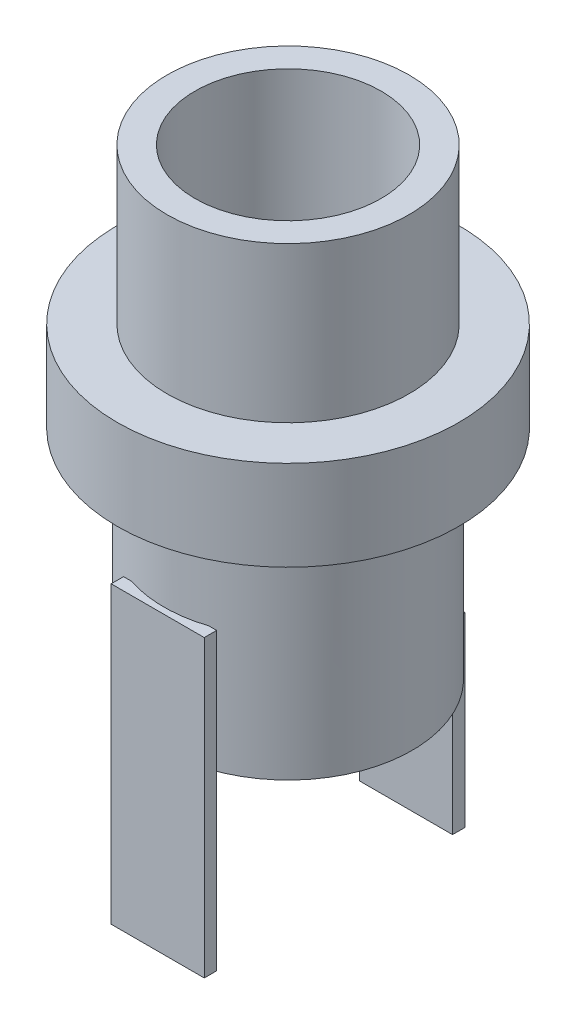
ISO-10303-21;
HEADER;
FILE_DESCRIPTION(('STEP AP214'),'2;1');
FILE_NAME('part.step','',(''),(''),'','','');
FILE_SCHEMA(('AUTOMOTIVE_DESIGN { 1 0 10303 214 1 1 1 1 }'));
ENDSEC;
DATA;
#1=APPLICATION_CONTEXT('core data for automotive mechanical design processes');
#2=APPLICATION_PROTOCOL_DEFINITION('international standard','automotive_design',2000,#1);
#3=PRODUCT_CONTEXT('',#1,'mechanical');
#4=PRODUCT('Part','Part','',(#3));
#5=PRODUCT_RELATED_PRODUCT_CATEGORY('part','',(#4));
#6=PRODUCT_DEFINITION_FORMATION('','',#4);
#7=PRODUCT_DEFINITION_CONTEXT('part definition',#1,'design');
#8=PRODUCT_DEFINITION('design','',#6,#7);
#9=PRODUCT_DEFINITION_SHAPE('','',#8);
#10=(LENGTH_UNIT() NAMED_UNIT(*) SI_UNIT(.MILLI.,.METRE.));
#11=(NAMED_UNIT(*) PLANE_ANGLE_UNIT() SI_UNIT($,.RADIAN.));
#12=(NAMED_UNIT(*) SI_UNIT($,.STERADIAN.) SOLID_ANGLE_UNIT());
#13=UNCERTAINTY_MEASURE_WITH_UNIT(LENGTH_MEASURE(1.E-05),#10,'distance_accuracy_value','');
#14=(GEOMETRIC_REPRESENTATION_CONTEXT(3) GLOBAL_UNCERTAINTY_ASSIGNED_CONTEXT((#13)) GLOBAL_UNIT_ASSIGNED_CONTEXT((#10,
#11,#12)) REPRESENTATION_CONTEXT('',''));
#15=CARTESIAN_POINT('',(0.,0.,0.));
#16=DIRECTION('',(0.,0.,1.));
#17=DIRECTION('',(1.,0.,0.));
#18=AXIS2_PLACEMENT_3D('',#15,#16,#17);
#19=CARTESIAN_POINT('',(0.,-7.,0.));
#20=DIRECTION('',(0.,1.,0.));
#21=DIRECTION('',(0.,0.,1.));
#22=AXIS2_PLACEMENT_3D('',#19,#20,#21);
#23=CYLINDRICAL_SURFACE('',#22,4.);
#24=CARTESIAN_POINT('',(0.,0.,0.));
#25=DIRECTION('',(0.,-1.,0.));
#26=DIRECTION('',(0.,0.,-1.));
#27=AXIS2_PLACEMENT_3D('',#24,#25,#26);
#28=CIRCLE('',#27,4.);
#29=CARTESIAN_POINT('',(0.,0.,-4.));
#30=VERTEX_POINT('',#29);
#31=EDGE_CURVE('E346',#30,#30,#28,.T.);
#32=ORIENTED_EDGE('',*,*,#31,.T.);
#33=EDGE_LOOP('',(#32));
#34=FACE_BOUND('',#33,.T.);
#35=DIRECTION('',(0.,1.,0.));
#36=VECTOR('',#35,1.);
#37=CARTESIAN_POINT('',(-1.24899959967968,-7.,-3.8));
#38=LINE('',#37,#36);
#39=CARTESIAN_POINT('',(-1.24899959967968,-7.,-3.8));
#40=VERTEX_POINT('',#39);
#41=CARTESIAN_POINT('',(-1.24899959967968,-6.5,-3.8));
#42=VERTEX_POINT('',#41);
#43=EDGE_CURVE('E228',#40,#42,#38,.T.);
#44=ORIENTED_EDGE('',*,*,#43,.F.);
#45=CARTESIAN_POINT('',(0.,-7.,0.));
#46=DIRECTION('',(0.,-1.,0.));
#47=DIRECTION('',(0.,0.,-1.));
#48=AXIS2_PLACEMENT_3D('',#45,#46,#47);
#49=CIRCLE('',#48,4.);
#50=CARTESIAN_POINT('',(-3.8,-7.,-1.24899959967968));
#51=VERTEX_POINT('',#50);
#52=EDGE_CURVE('E345',#51,#40,#49,.T.);
#53=ORIENTED_EDGE('',*,*,#52,.F.);
#54=DIRECTION('',(0.,1.,0.));
#55=VECTOR('',#54,1.);
#56=CARTESIAN_POINT('',(-3.8,-7.,-1.24899959967968));
#57=LINE('',#56,#55);
#58=CARTESIAN_POINT('',(-3.8,-6.5,-1.24899959967968));
#59=VERTEX_POINT('',#58);
#60=EDGE_CURVE('E67',#59,#51,#57,.F.);
#61=ORIENTED_EDGE('',*,*,#60,.F.);
#62=CARTESIAN_POINT('',(0.,-6.5,0.));
#63=DIRECTION('',(0.,1.,0.));
#64=DIRECTION('',(0.,0.,1.));
#65=AXIS2_PLACEMENT_3D('',#62,#63,#64);
#66=CIRCLE('',#65,4.);
#67=CARTESIAN_POINT('',(-3.8,-6.5,1.24899959967968));
#68=VERTEX_POINT('',#67);
#69=EDGE_CURVE('E375',#59,#68,#66,.T.);
#70=ORIENTED_EDGE('',*,*,#69,.T.);
#71=DIRECTION('',(0.,1.,0.));
#72=VECTOR('',#71,1.);
#73=CARTESIAN_POINT('',(-3.8,-7.,1.24899959967968));
#74=LINE('',#73,#72);
#75=CARTESIAN_POINT('',(-3.8,-7.,1.24899959967968));
#76=VERTEX_POINT('',#75);
#77=EDGE_CURVE('E278',#76,#68,#74,.T.);
#78=ORIENTED_EDGE('',*,*,#77,.F.);
#79=CARTESIAN_POINT('',(-1.24899959967968,-7.,3.8));
#80=VERTEX_POINT('',#79);
#81=EDGE_CURVE('E340',#80,#76,#49,.T.);
#82=ORIENTED_EDGE('',*,*,#81,.F.);
#83=DIRECTION('',(0.,1.,0.));
#84=VECTOR('',#83,1.);
#85=CARTESIAN_POINT('',(-1.24899959967968,-7.,3.8));
#86=LINE('',#85,#84);
#87=CARTESIAN_POINT('',(-1.24899959967968,-3.,3.8));
#88=VERTEX_POINT('',#87);
#89=EDGE_CURVE('E325',#88,#80,#86,.F.);
#90=ORIENTED_EDGE('',*,*,#89,.F.);
#91=CARTESIAN_POINT('',(0.,-3.,0.));
#92=DIRECTION('',(0.,-1.,0.));
#93=DIRECTION('',(0.,0.,-1.));
#94=AXIS2_PLACEMENT_3D('',#91,#92,#93);
#95=CIRCLE('',#94,4.);
#96=CARTESIAN_POINT('',(1.24899959967968,-3.,3.8));
#97=VERTEX_POINT('',#96);
#98=EDGE_CURVE('E369',#97,#88,#95,.T.);
#99=ORIENTED_EDGE('',*,*,#98,.F.);
#100=DIRECTION('',(0.,1.,0.));
#101=VECTOR('',#100,1.);
#102=CARTESIAN_POINT('',(1.24899959967968,-7.,3.8));
#103=LINE('',#102,#101);
#104=CARTESIAN_POINT('',(1.24899959967968,-7.,3.8));
#105=VERTEX_POINT('',#104);
#106=EDGE_CURVE('E328',#105,#97,#103,.T.);
#107=ORIENTED_EDGE('',*,*,#106,.F.);
#108=CARTESIAN_POINT('',(1.24899959967968,-7.,-3.8));
#109=VERTEX_POINT('',#108);
#110=EDGE_CURVE('E336',#109,#105,#49,.T.);
#111=ORIENTED_EDGE('',*,*,#110,.F.);
#112=DIRECTION('',(0.,1.,0.));
#113=VECTOR('',#112,1.);
#114=CARTESIAN_POINT('',(1.24899959967968,-7.,-3.8));
#115=LINE('',#114,#113);
#116=CARTESIAN_POINT('',(1.24899959967968,-6.5,-3.8));
#117=VERTEX_POINT('',#116);
#118=EDGE_CURVE('E59',#117,#109,#115,.F.);
#119=ORIENTED_EDGE('',*,*,#118,.F.);
#120=CARTESIAN_POINT('',(0.,-6.5,0.));
#121=DIRECTION('',(0.,1.,0.));
#122=DIRECTION('',(0.,0.,1.));
#123=AXIS2_PLACEMENT_3D('',#120,#121,#122);
#124=CIRCLE('',#123,4.);
#125=EDGE_CURVE('E11',#117,#42,#124,.T.);
#126=ORIENTED_EDGE('',*,*,#125,.T.);
#127=EDGE_LOOP('',(#44,#53,#61,#70,#78,#82,#90,#99,#107,#111,#119,#126));
#128=FACE_BOUND('',#127,.T.);
#129=ADVANCED_FACE('F43',(#34,#128),#23,.T.);
#130=CARTESIAN_POINT('',(0.,-7.,0.));
#131=DIRECTION('',(0.,-1.,0.));
#132=DIRECTION('',(0.,0.,-1.));
#133=AXIS2_PLACEMENT_3D('',#130,#131,#132);
#134=PLANE('',#133);
#135=ORIENTED_EDGE('',*,*,#52,.T.);
#136=DIRECTION('',(1.,0.,0.));
#137=VECTOR('',#136,1.);
#138=CARTESIAN_POINT('',(0.,-7.,-3.8));
#139=LINE('',#138,#137);
#140=EDGE_CURVE('E52',#40,#109,#139,.T.);
#141=ORIENTED_EDGE('',*,*,#140,.T.);
#142=ORIENTED_EDGE('',*,*,#110,.T.);
#143=DIRECTION('',(-1.,0.,0.));
#144=VECTOR('',#143,1.);
#145=CARTESIAN_POINT('',(0.,-7.,3.8));
#146=LINE('',#145,#144);
#147=EDGE_CURVE('E350',#105,#80,#146,.T.);
#148=ORIENTED_EDGE('',*,*,#147,.T.);
#149=ORIENTED_EDGE('',*,*,#81,.T.);
#150=DIRECTION('',(0.,0.,-1.));
#151=VECTOR('',#150,1.);
#152=CARTESIAN_POINT('',(-3.8,-7.,0.));
#153=LINE('',#152,#151);
#154=EDGE_CURVE('E372',#76,#51,#153,.T.);
#155=ORIENTED_EDGE('',*,*,#154,.T.);
#156=EDGE_LOOP('',(#135,#141,#142,#148,#149,#155));
#157=FACE_BOUND('',#156,.T.);
#158=ADVANCED_FACE('F382',(#157),#134,.T.);
#159=CARTESIAN_POINT('',(0.,2.9,0.));
#160=DIRECTION('',(0.,-1.,0.));
#161=DIRECTION('',(0.,0.,-1.));
#162=AXIS2_PLACEMENT_3D('',#159,#160,#161);
#163=CYLINDRICAL_SURFACE('',#162,5.5);
#164=CARTESIAN_POINT('',(0.,2.9,0.));
#165=DIRECTION('',(0.,1.,0.));
#166=DIRECTION('',(0.,0.,1.));
#167=AXIS2_PLACEMENT_3D('',#164,#165,#166);
#168=CIRCLE('',#167,5.5);
#169=CARTESIAN_POINT('',(0.,2.9,5.5));
#170=VERTEX_POINT('',#169);
#171=EDGE_CURVE('E359',#170,#170,#168,.T.);
#172=ORIENTED_EDGE('',*,*,#171,.F.);
#173=EDGE_LOOP('',(#172));
#174=FACE_BOUND('',#173,.T.);
#175=CARTESIAN_POINT('',(0.,0.,0.));
#176=DIRECTION('',(0.,1.,0.));
#177=DIRECTION('',(0.,0.,1.));
#178=AXIS2_PLACEMENT_3D('',#175,#176,#177);
#179=CIRCLE('',#178,5.5);
#180=CARTESIAN_POINT('',(0.,0.,5.5));
#181=VERTEX_POINT('',#180);
#182=EDGE_CURVE('E355',#181,#181,#179,.T.);
#183=ORIENTED_EDGE('',*,*,#182,.T.);
#184=EDGE_LOOP('',(#183));
#185=FACE_BOUND('',#184,.T.);
#186=ADVANCED_FACE('F45',(#174,#185),#163,.T.);
#187=CARTESIAN_POINT('',(0.,2.9,0.));
#188=DIRECTION('',(0.,1.,0.));
#189=DIRECTION('',(0.,0.,1.));
#190=AXIS2_PLACEMENT_3D('',#187,#188,#189);
#191=PLANE('',#190);
#192=CARTESIAN_POINT('',(0.,2.9,0.));
#193=DIRECTION('',(0.,1.,0.));
#194=DIRECTION('',(0.,0.,1.));
#195=AXIS2_PLACEMENT_3D('',#192,#193,#194);
#196=CIRCLE('',#195,3.9);
#197=CARTESIAN_POINT('',(0.,2.9,3.9));
#198=VERTEX_POINT('',#197);
#199=EDGE_CURVE('E351',#198,#198,#196,.T.);
#200=ORIENTED_EDGE('',*,*,#199,.F.);
#201=EDGE_LOOP('',(#200));
#202=FACE_BOUND('',#201,.T.);
#203=ORIENTED_EDGE('',*,*,#171,.T.);
#204=EDGE_LOOP('',(#203));
#205=FACE_BOUND('',#204,.T.);
#206=ADVANCED_FACE('F450',(#202,#205),#191,.T.);
#207=CARTESIAN_POINT('',(0.,0.,0.));
#208=DIRECTION('',(0.,1.,0.));
#209=DIRECTION('',(0.,0.,1.));
#210=AXIS2_PLACEMENT_3D('',#207,#208,#209);
#211=PLANE('',#210);
#212=ORIENTED_EDGE('',*,*,#31,.F.);
#213=EDGE_LOOP('',(#212));
#214=FACE_BOUND('',#213,.T.);
#215=ORIENTED_EDGE('',*,*,#182,.F.);
#216=EDGE_LOOP('',(#215));
#217=FACE_BOUND('',#216,.T.);
#218=ADVANCED_FACE('F448',(#214,#217),#211,.F.);
#219=CARTESIAN_POINT('',(0.,7.9,0.));
#220=DIRECTION('',(0.,-1.,0.));
#221=DIRECTION('',(0.,0.,-1.));
#222=AXIS2_PLACEMENT_3D('',#219,#220,#221);
#223=CYLINDRICAL_SURFACE('',#222,3.9);
#224=CARTESIAN_POINT('',(0.,7.9,0.));
#225=DIRECTION('',(0.,1.,0.));
#226=DIRECTION('',(0.,0.,1.));
#227=AXIS2_PLACEMENT_3D('',#224,#225,#226);
#228=CIRCLE('',#227,3.9);
#229=CARTESIAN_POINT('',(0.,7.9,3.9));
#230=VERTEX_POINT('',#229);
#231=EDGE_CURVE('E344',#230,#230,#228,.T.);
#232=ORIENTED_EDGE('',*,*,#231,.F.);
#233=EDGE_LOOP('',(#232));
#234=FACE_BOUND('',#233,.T.);
#235=ORIENTED_EDGE('',*,*,#199,.T.);
#236=EDGE_LOOP('',(#235));
#237=FACE_BOUND('',#236,.T.);
#238=ADVANCED_FACE('F444',(#234,#237),#223,.T.);
#239=CARTESIAN_POINT('',(0.,7.9,0.));
#240=DIRECTION('',(0.,1.,0.));
#241=DIRECTION('',(0.,0.,1.));
#242=AXIS2_PLACEMENT_3D('',#239,#240,#241);
#243=PLANE('',#242);
#244=CARTESIAN_POINT('',(0.,7.9,0.));
#245=DIRECTION('',(0.,1.,0.));
#246=DIRECTION('',(0.,0.,1.));
#247=AXIS2_PLACEMENT_3D('',#244,#245,#246);
#248=CIRCLE('',#247,3.);
#249=CARTESIAN_POINT('',(0.,7.9,3.));
#250=VERTEX_POINT('',#249);
#251=EDGE_CURVE('E331',#250,#250,#248,.T.);
#252=ORIENTED_EDGE('',*,*,#251,.F.);
#253=EDGE_LOOP('',(#252));
#254=FACE_BOUND('',#253,.T.);
#255=ORIENTED_EDGE('',*,*,#231,.T.);
#256=EDGE_LOOP('',(#255));
#257=FACE_BOUND('',#256,.T.);
#258=ADVANCED_FACE('F440',(#254,#257),#243,.T.);
#259=CARTESIAN_POINT('',(0.,-2.1,0.));
#260=DIRECTION('',(0.,1.,0.));
#261=DIRECTION('',(0.,0.,1.));
#262=AXIS2_PLACEMENT_3D('',#259,#260,#261);
#263=CYLINDRICAL_SURFACE('',#262,3.);
#264=CARTESIAN_POINT('',(0.,-2.1,0.));
#265=DIRECTION('',(0.,1.,0.));
#266=DIRECTION('',(0.,0.,1.));
#267=AXIS2_PLACEMENT_3D('',#264,#265,#266);
#268=CIRCLE('',#267,3.);
#269=CARTESIAN_POINT('',(0.,-2.1,3.));
#270=VERTEX_POINT('',#269);
#271=EDGE_CURVE('E332',#270,#270,#268,.T.);
#272=ORIENTED_EDGE('',*,*,#271,.F.);
#273=EDGE_LOOP('',(#272));
#274=FACE_BOUND('',#273,.T.);
#275=ORIENTED_EDGE('',*,*,#251,.T.);
#276=EDGE_LOOP('',(#275));
#277=FACE_BOUND('',#276,.T.);
#278=ADVANCED_FACE('F443',(#274,#277),#263,.F.);
#279=CARTESIAN_POINT('',(0.,-2.1,0.));
#280=DIRECTION('',(0.,1.,0.));
#281=DIRECTION('',(0.,0.,1.));
#282=AXIS2_PLACEMENT_3D('',#279,#280,#281);
#283=PLANE('',#282);
#284=ORIENTED_EDGE('',*,*,#271,.T.);
#285=EDGE_LOOP('',(#284));
#286=FACE_BOUND('',#285,.T.);
#287=ADVANCED_FACE('F502',(#286),#283,.T.);
#288=CARTESIAN_POINT('',(0.,0.,3.8));
#289=DIRECTION('',(0.,0.,1.));
#290=DIRECTION('',(1.,0.,0.));
#291=AXIS2_PLACEMENT_3D('',#288,#289,#290);
#292=PLANE('',#291);
#293=ORIENTED_EDGE('',*,*,#147,.F.);
#294=ORIENTED_EDGE('',*,*,#106,.T.);
#295=DIRECTION('',(-1.,0.,0.));
#296=VECTOR('',#295,1.);
#297=CARTESIAN_POINT('',(-1.5,-3.,3.8));
#298=LINE('',#297,#296);
#299=CARTESIAN_POINT('',(1.5,-3.,3.8));
#300=VERTEX_POINT('',#299);
#301=EDGE_CURVE('E287',#300,#97,#298,.T.);
#302=ORIENTED_EDGE('',*,*,#301,.F.);
#303=DIRECTION('',(0.,1.,0.));
#304=VECTOR('',#303,1.);
#305=CARTESIAN_POINT('',(1.5,-3.,3.8));
#306=LINE('',#305,#304);
#307=CARTESIAN_POINT('',(1.5,-12.5,3.8));
#308=VERTEX_POINT('',#307);
#309=EDGE_CURVE('E303',#308,#300,#306,.T.);
#310=ORIENTED_EDGE('',*,*,#309,.F.);
#311=DIRECTION('',(1.,0.,0.));
#312=VECTOR('',#311,1.);
#313=CARTESIAN_POINT('',(-1.5,-12.5,3.8));
#314=LINE('',#313,#312);
#315=CARTESIAN_POINT('',(-1.5,-12.5,3.8));
#316=VERTEX_POINT('',#315);
#317=EDGE_CURVE('E300',#316,#308,#314,.T.);
#318=ORIENTED_EDGE('',*,*,#317,.F.);
#319=DIRECTION('',(0.,-1.,0.));
#320=VECTOR('',#319,1.);
#321=CARTESIAN_POINT('',(-1.5,-3.,3.8));
#322=LINE('',#321,#320);
#323=CARTESIAN_POINT('',(-1.5,-3.,3.8));
#324=VERTEX_POINT('',#323);
#325=EDGE_CURVE('E281',#324,#316,#322,.T.);
#326=ORIENTED_EDGE('',*,*,#325,.F.);
#327=EDGE_CURVE('E306',#88,#324,#298,.T.);
#328=ORIENTED_EDGE('',*,*,#327,.F.);
#329=ORIENTED_EDGE('',*,*,#89,.T.);
#330=EDGE_LOOP('',(#293,#294,#302,#310,#318,#326,#328,#329));
#331=FACE_BOUND('',#330,.T.);
#332=ADVANCED_FACE('F512',(#331),#292,.F.);
#333=CARTESIAN_POINT('',(-1.5,-3.,4.2));
#334=DIRECTION('',(1.,0.,0.));
#335=DIRECTION('',(0.,1.,0.));
#336=AXIS2_PLACEMENT_3D('',#333,#334,#335);
#337=PLANE('',#336);
#338=ORIENTED_EDGE('',*,*,#325,.T.);
#339=DIRECTION('',(0.,0.,-1.));
#340=VECTOR('',#339,1.);
#341=CARTESIAN_POINT('',(-1.5,-12.5,4.2));
#342=LINE('',#341,#340);
#343=CARTESIAN_POINT('',(-1.5,-12.5,4.2));
#344=VERTEX_POINT('',#343);
#345=EDGE_CURVE('E321',#344,#316,#342,.T.);
#346=ORIENTED_EDGE('',*,*,#345,.F.);
#347=DIRECTION('',(0.,-1.,0.));
#348=VECTOR('',#347,1.);
#349=CARTESIAN_POINT('',(-1.5,-3.,4.2));
#350=LINE('',#349,#348);
#351=CARTESIAN_POINT('',(-1.5,-3.,4.2));
#352=VERTEX_POINT('',#351);
#353=EDGE_CURVE('E282',#352,#344,#350,.T.);
#354=ORIENTED_EDGE('',*,*,#353,.F.);
#355=DIRECTION('',(0.,0.,-1.));
#356=VECTOR('',#355,1.);
#357=CARTESIAN_POINT('',(-1.5,-3.,4.2));
#358=LINE('',#357,#356);
#359=EDGE_CURVE('E296',#352,#324,#358,.T.);
#360=ORIENTED_EDGE('',*,*,#359,.T.);
#361=EDGE_LOOP('',(#338,#346,#354,#360));
#362=FACE_BOUND('',#361,.T.);
#363=ADVANCED_FACE('F523',(#362),#337,.F.);
#364=CARTESIAN_POINT('',(-1.5,-12.5,4.2));
#365=DIRECTION('',(0.,1.,0.));
#366=DIRECTION('',(0.,0.,1.));
#367=AXIS2_PLACEMENT_3D('',#364,#365,#366);
#368=PLANE('',#367);
#369=ORIENTED_EDGE('',*,*,#317,.T.);
#370=DIRECTION('',(0.,0.,-1.));
#371=VECTOR('',#370,1.);
#372=CARTESIAN_POINT('',(1.5,-12.5,4.2));
#373=LINE('',#372,#371);
#374=CARTESIAN_POINT('',(1.5,-12.5,4.2));
#375=VERTEX_POINT('',#374);
#376=EDGE_CURVE('E317',#375,#308,#373,.T.);
#377=ORIENTED_EDGE('',*,*,#376,.F.);
#378=DIRECTION('',(1.,0.,0.));
#379=VECTOR('',#378,1.);
#380=CARTESIAN_POINT('',(-1.5,-12.5,4.2));
#381=LINE('',#380,#379);
#382=EDGE_CURVE('E286',#344,#375,#381,.T.);
#383=ORIENTED_EDGE('',*,*,#382,.F.);
#384=ORIENTED_EDGE('',*,*,#345,.T.);
#385=EDGE_LOOP('',(#369,#377,#383,#384));
#386=FACE_BOUND('',#385,.T.);
#387=ADVANCED_FACE('F534',(#386),#368,.F.);
#388=CARTESIAN_POINT('',(1.5,-3.,4.2));
#389=DIRECTION('',(-1.,0.,0.));
#390=DIRECTION('',(0.,-1.,0.));
#391=AXIS2_PLACEMENT_3D('',#388,#389,#390);
#392=PLANE('',#391);
#393=ORIENTED_EDGE('',*,*,#309,.T.);
#394=DIRECTION('',(0.,0.,-1.));
#395=VECTOR('',#394,1.);
#396=CARTESIAN_POINT('',(1.5,-3.,4.2));
#397=LINE('',#396,#395);
#398=CARTESIAN_POINT('',(1.5,-3.,4.2));
#399=VERTEX_POINT('',#398);
#400=EDGE_CURVE('E313',#399,#300,#397,.T.);
#401=ORIENTED_EDGE('',*,*,#400,.F.);
#402=DIRECTION('',(0.,1.,0.));
#403=VECTOR('',#402,1.);
#404=CARTESIAN_POINT('',(1.5,-3.,4.2));
#405=LINE('',#404,#403);
#406=EDGE_CURVE('E290',#375,#399,#405,.T.);
#407=ORIENTED_EDGE('',*,*,#406,.F.);
#408=ORIENTED_EDGE('',*,*,#376,.T.);
#409=EDGE_LOOP('',(#393,#401,#407,#408));
#410=FACE_BOUND('',#409,.T.);
#411=ADVANCED_FACE('F545',(#410),#392,.F.);
#412=CARTESIAN_POINT('',(-1.5,-3.,4.2));
#413=DIRECTION('',(0.,-1.,0.));
#414=DIRECTION('',(0.,0.,-1.));
#415=AXIS2_PLACEMENT_3D('',#412,#413,#414);
#416=PLANE('',#415);
#417=ORIENTED_EDGE('',*,*,#301,.T.);
#418=ORIENTED_EDGE('',*,*,#98,.T.);
#419=ORIENTED_EDGE('',*,*,#327,.T.);
#420=ORIENTED_EDGE('',*,*,#359,.F.);
#421=DIRECTION('',(-1.,0.,0.));
#422=VECTOR('',#421,1.);
#423=CARTESIAN_POINT('',(-1.5,-3.,4.2));
#424=LINE('',#423,#422);
#425=EDGE_CURVE('E293',#399,#352,#424,.T.);
#426=ORIENTED_EDGE('',*,*,#425,.F.);
#427=ORIENTED_EDGE('',*,*,#400,.T.);
#428=EDGE_LOOP('',(#417,#418,#419,#420,#426,#427));
#429=FACE_BOUND('',#428,.T.);
#430=ADVANCED_FACE('F556',(#429),#416,.F.);
#431=CARTESIAN_POINT('',(0.,0.,4.2));
#432=DIRECTION('',(0.,0.,1.));
#433=DIRECTION('',(1.,0.,0.));
#434=AXIS2_PLACEMENT_3D('',#431,#432,#433);
#435=PLANE('',#434);
#436=ORIENTED_EDGE('',*,*,#353,.T.);
#437=ORIENTED_EDGE('',*,*,#382,.T.);
#438=ORIENTED_EDGE('',*,*,#406,.T.);
#439=ORIENTED_EDGE('',*,*,#425,.T.);
#440=EDGE_LOOP('',(#436,#437,#438,#439));
#441=FACE_BOUND('',#440,.T.);
#442=ADVANCED_FACE('F567',(#441),#435,.T.);
#443=CARTESIAN_POINT('',(-3.8,0.,0.));
#444=DIRECTION('',(-1.,0.,0.));
#445=DIRECTION('',(0.,0.,1.));
#446=AXIS2_PLACEMENT_3D('',#443,#444,#445);
#447=PLANE('',#446);
#448=ORIENTED_EDGE('',*,*,#154,.F.);
#449=ORIENTED_EDGE('',*,*,#77,.T.);
#450=DIRECTION('',(0.,0.,1.));
#451=VECTOR('',#450,1.);
#452=CARTESIAN_POINT('',(-3.8,-6.5,-1.5));
#453=LINE('',#452,#451);
#454=CARTESIAN_POINT('',(-3.8,-6.5,1.5));
#455=VERTEX_POINT('',#454);
#456=EDGE_CURVE('E253',#68,#455,#453,.T.);
#457=ORIENTED_EDGE('',*,*,#456,.T.);
#458=DIRECTION('',(0.,-1.,0.));
#459=VECTOR('',#458,1.);
#460=CARTESIAN_POINT('',(-3.8,-6.5,1.5));
#461=LINE('',#460,#459);
#462=CARTESIAN_POINT('',(-3.8,-12.5,1.5));
#463=VERTEX_POINT('',#462);
#464=EDGE_CURVE('E257',#455,#463,#461,.T.);
#465=ORIENTED_EDGE('',*,*,#464,.T.);
#466=DIRECTION('',(0.,0.,-1.));
#467=VECTOR('',#466,1.);
#468=CARTESIAN_POINT('',(-3.8,-12.5,-1.5));
#469=LINE('',#468,#467);
#470=CARTESIAN_POINT('',(-3.8,-12.5,-1.5));
#471=VERTEX_POINT('',#470);
#472=EDGE_CURVE('E237',#463,#471,#469,.T.);
#473=ORIENTED_EDGE('',*,*,#472,.T.);
#474=DIRECTION('',(0.,1.,0.));
#475=VECTOR('',#474,1.);
#476=CARTESIAN_POINT('',(-3.8,-6.5,-1.5));
#477=LINE('',#476,#475);
#478=CARTESIAN_POINT('',(-3.8,-6.5,-1.5));
#479=VERTEX_POINT('',#478);
#480=EDGE_CURVE('E231',#471,#479,#477,.T.);
#481=ORIENTED_EDGE('',*,*,#480,.T.);
#482=EDGE_CURVE('E254',#479,#59,#453,.T.);
#483=ORIENTED_EDGE('',*,*,#482,.T.);
#484=ORIENTED_EDGE('',*,*,#60,.T.);
#485=EDGE_LOOP('',(#448,#449,#457,#465,#473,#481,#483,#484));
#486=FACE_BOUND('',#485,.T.);
#487=ADVANCED_FACE('F394',(#486),#447,.F.);
#488=CARTESIAN_POINT('',(-4.2,-6.5,-1.5));
#489=DIRECTION('',(0.,0.,-1.));
#490=DIRECTION('',(0.,1.,0.));
#491=AXIS2_PLACEMENT_3D('',#488,#489,#490);
#492=PLANE('',#491);
#493=ORIENTED_EDGE('',*,*,#480,.F.);
#494=DIRECTION('',(1.,0.,0.));
#495=VECTOR('',#494,1.);
#496=CARTESIAN_POINT('',(-4.2,-12.5,-1.5));
#497=LINE('',#496,#495);
#498=CARTESIAN_POINT('',(-4.2,-12.5,-1.5));
#499=VERTEX_POINT('',#498);
#500=EDGE_CURVE('E264',#499,#471,#497,.T.);
#501=ORIENTED_EDGE('',*,*,#500,.F.);
#502=DIRECTION('',(0.,1.,0.));
#503=VECTOR('',#502,1.);
#504=CARTESIAN_POINT('',(-4.2,-6.5,-1.5));
#505=LINE('',#504,#503);
#506=CARTESIAN_POINT('',(-4.2,-6.5,-1.5));
#507=VERTEX_POINT('',#506);
#508=EDGE_CURVE('E232',#499,#507,#505,.T.);
#509=ORIENTED_EDGE('',*,*,#508,.T.);
#510=DIRECTION('',(1.,0.,0.));
#511=VECTOR('',#510,1.);
#512=CARTESIAN_POINT('',(-4.2,-6.5,-1.5));
#513=LINE('',#512,#511);
#514=EDGE_CURVE('E249',#507,#479,#513,.T.);
#515=ORIENTED_EDGE('',*,*,#514,.T.);
#516=EDGE_LOOP('',(#493,#501,#509,#515));
#517=FACE_BOUND('',#516,.T.);
#518=ADVANCED_FACE('F410',(#517),#492,.T.);
#519=CARTESIAN_POINT('',(-4.2,-12.5,-1.5));
#520=DIRECTION('',(0.,-1.,0.));
#521=DIRECTION('',(0.,0.,-1.));
#522=AXIS2_PLACEMENT_3D('',#519,#520,#521);
#523=PLANE('',#522);
#524=ORIENTED_EDGE('',*,*,#472,.F.);
#525=DIRECTION('',(1.,0.,0.));
#526=VECTOR('',#525,1.);
#527=CARTESIAN_POINT('',(-4.2,-12.5,1.5));
#528=LINE('',#527,#526);
#529=CARTESIAN_POINT('',(-4.2,-12.5,1.5));
#530=VERTEX_POINT('',#529);
#531=EDGE_CURVE('E267',#530,#463,#528,.T.);
#532=ORIENTED_EDGE('',*,*,#531,.F.);
#533=DIRECTION('',(0.,0.,-1.));
#534=VECTOR('',#533,1.);
#535=CARTESIAN_POINT('',(-4.2,-12.5,-1.5));
#536=LINE('',#535,#534);
#537=EDGE_CURVE('E245',#530,#499,#536,.T.);
#538=ORIENTED_EDGE('',*,*,#537,.T.);
#539=ORIENTED_EDGE('',*,*,#500,.T.);
#540=EDGE_LOOP('',(#524,#532,#538,#539));
#541=FACE_BOUND('',#540,.T.);
#542=ADVANCED_FACE('F406',(#541),#523,.T.);
#543=CARTESIAN_POINT('',(-4.2,-6.5,1.5));
#544=DIRECTION('',(0.,0.,1.));
#545=DIRECTION('',(0.,-1.,0.));
#546=AXIS2_PLACEMENT_3D('',#543,#544,#545);
#547=PLANE('',#546);
#548=ORIENTED_EDGE('',*,*,#464,.F.);
#549=DIRECTION('',(1.,0.,0.));
#550=VECTOR('',#549,1.);
#551=CARTESIAN_POINT('',(-4.2,-6.5,1.5));
#552=LINE('',#551,#550);
#553=CARTESIAN_POINT('',(-4.2,-6.5,1.5));
#554=VERTEX_POINT('',#553);
#555=EDGE_CURVE('E270',#554,#455,#552,.T.);
#556=ORIENTED_EDGE('',*,*,#555,.F.);
#557=DIRECTION('',(0.,-1.,0.));
#558=VECTOR('',#557,1.);
#559=CARTESIAN_POINT('',(-4.2,-6.5,1.5));
#560=LINE('',#559,#558);
#561=EDGE_CURVE('E241',#554,#530,#560,.T.);
#562=ORIENTED_EDGE('',*,*,#561,.T.);
#563=ORIENTED_EDGE('',*,*,#531,.T.);
#564=EDGE_LOOP('',(#548,#556,#562,#563));
#565=FACE_BOUND('',#564,.T.);
#566=ADVANCED_FACE('F403',(#565),#547,.T.);
#567=CARTESIAN_POINT('',(-4.2,-6.5,-1.5));
#568=DIRECTION('',(0.,1.,0.));
#569=DIRECTION('',(0.,0.,1.));
#570=AXIS2_PLACEMENT_3D('',#567,#568,#569);
#571=PLANE('',#570);
#572=ORIENTED_EDGE('',*,*,#69,.F.);
#573=ORIENTED_EDGE('',*,*,#482,.F.);
#574=ORIENTED_EDGE('',*,*,#514,.F.);
#575=DIRECTION('',(0.,0.,1.));
#576=VECTOR('',#575,1.);
#577=CARTESIAN_POINT('',(-4.2,-6.5,-1.5));
#578=LINE('',#577,#576);
#579=EDGE_CURVE('E236',#507,#554,#578,.T.);
#580=ORIENTED_EDGE('',*,*,#579,.T.);
#581=ORIENTED_EDGE('',*,*,#555,.T.);
#582=ORIENTED_EDGE('',*,*,#456,.F.);
#583=EDGE_LOOP('',(#572,#573,#574,#580,#581,#582));
#584=FACE_BOUND('',#583,.T.);
#585=ADVANCED_FACE('F399',(#584),#571,.T.);
#586=CARTESIAN_POINT('',(-4.2,0.,0.));
#587=DIRECTION('',(-1.,0.,0.));
#588=DIRECTION('',(0.,0.,1.));
#589=AXIS2_PLACEMENT_3D('',#586,#587,#588);
#590=PLANE('',#589);
#591=ORIENTED_EDGE('',*,*,#508,.F.);
#592=ORIENTED_EDGE('',*,*,#537,.F.);
#593=ORIENTED_EDGE('',*,*,#561,.F.);
#594=ORIENTED_EDGE('',*,*,#579,.F.);
#595=EDGE_LOOP('',(#591,#592,#593,#594));
#596=FACE_BOUND('',#595,.T.);
#597=ADVANCED_FACE('F624',(#596),#590,.T.);
#598=CARTESIAN_POINT('',(0.,0.,-3.8));
#599=DIRECTION('',(0.,0.,-1.));
#600=DIRECTION('',(-1.,0.,0.));
#601=AXIS2_PLACEMENT_3D('',#598,#599,#600);
#602=PLANE('',#601);
#603=ORIENTED_EDGE('',*,*,#140,.F.);
#604=ORIENTED_EDGE('',*,*,#43,.T.);
#605=DIRECTION('',(-1.,0.,0.));
#606=VECTOR('',#605,1.);
#607=CARTESIAN_POINT('',(1.5,-6.5,-3.8));
#608=LINE('',#607,#606);
#609=CARTESIAN_POINT('',(-1.5,-6.5,-3.8));
#610=VERTEX_POINT('',#609);
#611=EDGE_CURVE('E213',#42,#610,#608,.T.);
#612=ORIENTED_EDGE('',*,*,#611,.T.);
#613=DIRECTION('',(0.,-1.,0.));
#614=VECTOR('',#613,1.);
#615=CARTESIAN_POINT('',(-1.5,-6.5,-3.8));
#616=LINE('',#615,#614);
#617=CARTESIAN_POINT('',(-1.5,-12.5,-3.8));
#618=VERTEX_POINT('',#617);
#619=EDGE_CURVE('E203',#610,#618,#616,.T.);
#620=ORIENTED_EDGE('',*,*,#619,.T.);
#621=DIRECTION('',(1.,0.,0.));
#622=VECTOR('',#621,1.);
#623=CARTESIAN_POINT('',(1.5,-12.5,-3.8));
#624=LINE('',#623,#622);
#625=CARTESIAN_POINT('',(1.5,-12.5,-3.8));
#626=VERTEX_POINT('',#625);
#627=EDGE_CURVE('E199',#618,#626,#624,.T.);
#628=ORIENTED_EDGE('',*,*,#627,.T.);
#629=DIRECTION('',(0.,1.,0.));
#630=VECTOR('',#629,1.);
#631=CARTESIAN_POINT('',(1.5,-6.5,-3.8));
#632=LINE('',#631,#630);
#633=CARTESIAN_POINT('',(1.5,-6.5,-3.8));
#634=VERTEX_POINT('',#633);
#635=EDGE_CURVE('E210',#626,#634,#632,.T.);
#636=ORIENTED_EDGE('',*,*,#635,.T.);
#637=EDGE_CURVE('E176',#634,#117,#608,.T.);
#638=ORIENTED_EDGE('',*,*,#637,.T.);
#639=ORIENTED_EDGE('',*,*,#118,.T.);
#640=EDGE_LOOP('',(#603,#604,#612,#620,#628,#636,#638,#639));
#641=FACE_BOUND('',#640,.T.);
#642=ADVANCED_FACE('F414',(#641),#602,.F.);
#643=CARTESIAN_POINT('',(1.5,-6.5,-4.2));
#644=DIRECTION('',(1.,0.,0.));
#645=DIRECTION('',(0.,1.,0.));
#646=AXIS2_PLACEMENT_3D('',#643,#644,#645);
#647=PLANE('',#646);
#648=ORIENTED_EDGE('',*,*,#635,.F.);
#649=DIRECTION('',(0.,0.,1.));
#650=VECTOR('',#649,1.);
#651=CARTESIAN_POINT('',(1.5,-12.5,-4.2));
#652=LINE('',#651,#650);
#653=CARTESIAN_POINT('',(1.5,-12.5,-4.2));
#654=VERTEX_POINT('',#653);
#655=EDGE_CURVE('E197',#654,#626,#652,.T.);
#656=ORIENTED_EDGE('',*,*,#655,.F.);
#657=DIRECTION('',(0.,1.,0.));
#658=VECTOR('',#657,1.);
#659=CARTESIAN_POINT('',(1.5,-6.5,-4.2));
#660=LINE('',#659,#658);
#661=CARTESIAN_POINT('',(1.5,-6.5,-4.2));
#662=VERTEX_POINT('',#661);
#663=EDGE_CURVE('E190',#654,#662,#660,.T.);
#664=ORIENTED_EDGE('',*,*,#663,.T.);
#665=DIRECTION('',(0.,0.,1.));
#666=VECTOR('',#665,1.);
#667=CARTESIAN_POINT('',(1.5,-6.5,-4.2));
#668=LINE('',#667,#666);
#669=EDGE_CURVE('E171',#662,#634,#668,.T.);
#670=ORIENTED_EDGE('',*,*,#669,.T.);
#671=EDGE_LOOP('',(#648,#656,#664,#670));
#672=FACE_BOUND('',#671,.T.);
#673=ADVANCED_FACE('F196',(#672),#647,.T.);
#674=CARTESIAN_POINT('',(1.5,-12.5,-4.2));
#675=DIRECTION('',(0.,-1.,0.));
#676=DIRECTION('',(0.,0.,-1.));
#677=AXIS2_PLACEMENT_3D('',#674,#675,#676);
#678=PLANE('',#677);
#679=ORIENTED_EDGE('',*,*,#627,.F.);
#680=DIRECTION('',(0.,0.,1.));
#681=VECTOR('',#680,1.);
#682=CARTESIAN_POINT('',(-1.5,-12.5,-4.2));
#683=LINE('',#682,#681);
#684=CARTESIAN_POINT('',(-1.5,-12.5,-4.2));
#685=VERTEX_POINT('',#684);
#686=EDGE_CURVE('E221',#685,#618,#683,.T.);
#687=ORIENTED_EDGE('',*,*,#686,.F.);
#688=DIRECTION('',(1.,0.,0.));
#689=VECTOR('',#688,1.);
#690=CARTESIAN_POINT('',(1.5,-12.5,-4.2));
#691=LINE('',#690,#689);
#692=EDGE_CURVE('E183',#685,#654,#691,.T.);
#693=ORIENTED_EDGE('',*,*,#692,.T.);
#694=ORIENTED_EDGE('',*,*,#655,.T.);
#695=EDGE_LOOP('',(#679,#687,#693,#694));
#696=FACE_BOUND('',#695,.T.);
#697=ADVANCED_FACE('F421',(#696),#678,.T.);
#698=CARTESIAN_POINT('',(-1.5,-6.5,-4.2));
#699=DIRECTION('',(-1.,0.,0.));
#700=DIRECTION('',(0.,-1.,0.));
#701=AXIS2_PLACEMENT_3D('',#698,#699,#700);
#702=PLANE('',#701);
#703=ORIENTED_EDGE('',*,*,#619,.F.);
#704=DIRECTION('',(0.,0.,1.));
#705=VECTOR('',#704,1.);
#706=CARTESIAN_POINT('',(-1.5,-6.5,-4.2));
#707=LINE('',#706,#705);
#708=CARTESIAN_POINT('',(-1.5,-6.5,-4.2));
#709=VERTEX_POINT('',#708);
#710=EDGE_CURVE('E182',#709,#610,#707,.T.);
#711=ORIENTED_EDGE('',*,*,#710,.F.);
#712=DIRECTION('',(0.,-1.,0.));
#713=VECTOR('',#712,1.);
#714=CARTESIAN_POINT('',(-1.5,-6.5,-4.2));
#715=LINE('',#714,#713);
#716=EDGE_CURVE('E193',#709,#685,#715,.T.);
#717=ORIENTED_EDGE('',*,*,#716,.T.);
#718=ORIENTED_EDGE('',*,*,#686,.T.);
#719=EDGE_LOOP('',(#703,#711,#717,#718));
#720=FACE_BOUND('',#719,.T.);
#721=ADVANCED_FACE('F418',(#720),#702,.T.);
#722=CARTESIAN_POINT('',(1.5,-6.5,-4.2));
#723=DIRECTION('',(0.,1.,0.));
#724=DIRECTION('',(0.,0.,1.));
#725=AXIS2_PLACEMENT_3D('',#722,#723,#724);
#726=PLANE('',#725);
#727=ORIENTED_EDGE('',*,*,#125,.F.);
#728=ORIENTED_EDGE('',*,*,#637,.F.);
#729=ORIENTED_EDGE('',*,*,#669,.F.);
#730=DIRECTION('',(-1.,0.,0.));
#731=VECTOR('',#730,1.);
#732=CARTESIAN_POINT('',(1.5,-6.5,-4.2));
#733=LINE('',#732,#731);
#734=EDGE_CURVE('E175',#662,#709,#733,.T.);
#735=ORIENTED_EDGE('',*,*,#734,.T.);
#736=ORIENTED_EDGE('',*,*,#710,.T.);
#737=ORIENTED_EDGE('',*,*,#611,.F.);
#738=EDGE_LOOP('',(#727,#728,#729,#735,#736,#737));
#739=FACE_BOUND('',#738,.T.);
#740=ADVANCED_FACE('F173',(#739),#726,.T.);
#741=CARTESIAN_POINT('',(0.,0.,-4.2));
#742=DIRECTION('',(0.,0.,-1.));
#743=DIRECTION('',(-1.,0.,0.));
#744=AXIS2_PLACEMENT_3D('',#741,#742,#743);
#745=PLANE('',#744);
#746=ORIENTED_EDGE('',*,*,#663,.F.);
#747=ORIENTED_EDGE('',*,*,#692,.F.);
#748=ORIENTED_EDGE('',*,*,#716,.F.);
#749=ORIENTED_EDGE('',*,*,#734,.F.);
#750=EDGE_LOOP('',(#746,#747,#748,#749));
#751=FACE_BOUND('',#750,.T.);
#752=ADVANCED_FACE('F188',(#751),#745,.T.);
#753=CLOSED_SHELL('',(#129,#158,#186,#206,#218,#238,#258,#278,#287,#332,#363,#387,#411,#430,
#442,#487,#518,#542,#566,#585,#597,#642,#673,#697,#721,#740,#752));
#754=MANIFOLD_SOLID_BREP('B2',#753);
#755=ADVANCED_BREP_SHAPE_REPRESENTATION('',(#18,#754),#14);
#756=SHAPE_DEFINITION_REPRESENTATION(#9,#755);
ENDSEC;
END-ISO-10303-21;
